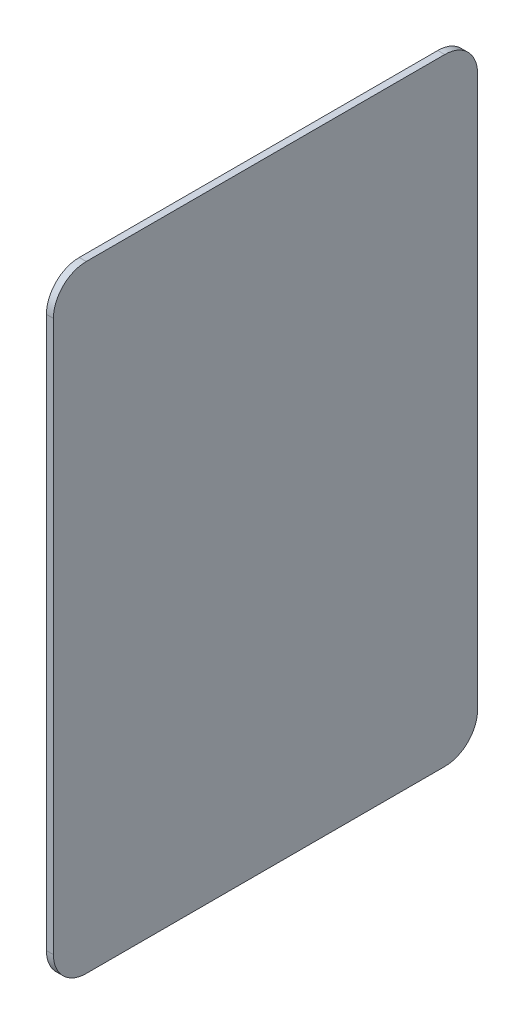
ISO-10303-21;
HEADER;
FILE_DESCRIPTION(('STEP AP214'),'2;1');
FILE_NAME('part.step','',(''),(''),'','','');
FILE_SCHEMA(('AUTOMOTIVE_DESIGN { 1 0 10303 214 1 1 1 1 }'));
ENDSEC;
DATA;
#1=APPLICATION_CONTEXT('core data for automotive mechanical design processes');
#2=APPLICATION_PROTOCOL_DEFINITION('international standard','automotive_design',2000,#1);
#3=PRODUCT_CONTEXT('',#1,'mechanical');
#4=PRODUCT('Part','Part','',(#3));
#5=PRODUCT_RELATED_PRODUCT_CATEGORY('part','',(#4));
#6=PRODUCT_DEFINITION_FORMATION('','',#4);
#7=PRODUCT_DEFINITION_CONTEXT('part definition',#1,'design');
#8=PRODUCT_DEFINITION('design','',#6,#7);
#9=PRODUCT_DEFINITION_SHAPE('','',#8);
#10=(LENGTH_UNIT() NAMED_UNIT(*) SI_UNIT(.MILLI.,.METRE.));
#11=(NAMED_UNIT(*) PLANE_ANGLE_UNIT() SI_UNIT($,.RADIAN.));
#12=(NAMED_UNIT(*) SI_UNIT($,.STERADIAN.) SOLID_ANGLE_UNIT());
#13=UNCERTAINTY_MEASURE_WITH_UNIT(LENGTH_MEASURE(1.E-05),#10,'distance_accuracy_value','');
#14=(GEOMETRIC_REPRESENTATION_CONTEXT(3) GLOBAL_UNCERTAINTY_ASSIGNED_CONTEXT((#13)) GLOBAL_UNIT_ASSIGNED_CONTEXT((#10,
#11,#12)) REPRESENTATION_CONTEXT('',''));
#15=CARTESIAN_POINT('',(0.,0.,0.));
#16=DIRECTION('',(0.,0.,1.));
#17=DIRECTION('',(1.,0.,0.));
#18=AXIS2_PLACEMENT_3D('',#15,#16,#17);
#19=CARTESIAN_POINT('',(-1.5875,94.531421496297,89.401946945784));
#20=DIRECTION('',(1.,0.,0.));
#21=DIRECTION('',(0.,0.,-1.));
#22=AXIS2_PLACEMENT_3D('',#19,#20,#21);
#23=CYLINDRICAL_SURFACE('',#22,7.453);
#24=CARTESIAN_POINT('',(0.,94.531421496297,89.401946945784));
#25=DIRECTION('',(1.,0.,0.));
#26=DIRECTION('',(0.,0.,-1.));
#27=AXIS2_PLACEMENT_3D('',#24,#25,#26);
#28=CIRCLE('',#27,7.453);
#29=CARTESIAN_POINT('',(0.,87.078421496297,89.4019469457841));
#30=VERTEX_POINT('',#29);
#31=CARTESIAN_POINT('',(0.,94.531421496297,81.948946945784));
#32=VERTEX_POINT('',#31);
#33=EDGE_CURVE('E135',#30,#32,#28,.T.);
#34=ORIENTED_EDGE('',*,*,#33,.F.);
#35=DIRECTION('',(1.,0.,0.));
#36=VECTOR('',#35,1.);
#37=CARTESIAN_POINT('',(-1.5875,87.078421496297,89.4019469457841));
#38=LINE('',#37,#36);
#39=CARTESIAN_POINT('',(-1.5875,87.078421496297,89.4019469457841));
#40=VERTEX_POINT('',#39);
#41=EDGE_CURVE('E12',#40,#30,#38,.T.);
#42=ORIENTED_EDGE('',*,*,#41,.F.);
#43=CARTESIAN_POINT('',(-1.5875,94.531421496297,89.401946945784));
#44=DIRECTION('',(1.,0.,0.));
#45=DIRECTION('',(0.,0.,-1.));
#46=AXIS2_PLACEMENT_3D('',#43,#44,#45);
#47=CIRCLE('',#46,7.453);
#48=CARTESIAN_POINT('',(-1.5875,94.531421496297,81.948946945784));
#49=VERTEX_POINT('',#48);
#50=EDGE_CURVE('E173',#40,#49,#47,.T.);
#51=ORIENTED_EDGE('',*,*,#50,.T.);
#52=DIRECTION('',(1.,0.,0.));
#53=VECTOR('',#52,1.);
#54=CARTESIAN_POINT('',(-1.5875,94.531421496297,81.948946945784));
#55=LINE('',#54,#53);
#56=EDGE_CURVE('E41',#49,#32,#55,.T.);
#57=ORIENTED_EDGE('',*,*,#56,.T.);
#58=EDGE_LOOP('',(#34,#42,#51,#57));
#59=FACE_BOUND('',#58,.T.);
#60=ADVANCED_FACE('F38',(#59),#23,.T.);
#61=CARTESIAN_POINT('',(-1.5875,87.078421496297,170.808946945784));
#62=DIRECTION('',(0.,-1.,0.));
#63=DIRECTION('',(0.,0.,-1.));
#64=AXIS2_PLACEMENT_3D('',#61,#62,#63);
#65=PLANE('',#64);
#66=DIRECTION('',(0.,0.,-1.));
#67=VECTOR('',#66,1.);
#68=CARTESIAN_POINT('',(0.,87.078421496297,170.808946945784));
#69=LINE('',#68,#67);
#70=CARTESIAN_POINT('',(0.,87.078421496297,170.808946945784));
#71=VERTEX_POINT('',#70);
#72=EDGE_CURVE('E169',#71,#30,#69,.T.);
#73=ORIENTED_EDGE('',*,*,#72,.F.);
#74=DIRECTION('',(1.,0.,0.));
#75=VECTOR('',#74,1.);
#76=CARTESIAN_POINT('',(-1.5875,87.078421496297,170.808946945784));
#77=LINE('',#76,#75);
#78=CARTESIAN_POINT('',(-1.5875,87.078421496297,170.808946945784));
#79=VERTEX_POINT('',#78);
#80=EDGE_CURVE('E47',#79,#71,#77,.T.);
#81=ORIENTED_EDGE('',*,*,#80,.F.);
#82=DIRECTION('',(0.,0.,-1.));
#83=VECTOR('',#82,1.);
#84=CARTESIAN_POINT('',(-1.5875,87.078421496297,170.808946945784));
#85=LINE('',#84,#83);
#86=EDGE_CURVE('E125',#79,#40,#85,.T.);
#87=ORIENTED_EDGE('',*,*,#86,.T.);
#88=ORIENTED_EDGE('',*,*,#41,.T.);
#89=EDGE_LOOP('',(#73,#81,#87,#88));
#90=FACE_BOUND('',#89,.T.);
#91=ADVANCED_FACE('F187',(#90),#65,.T.);
#92=CARTESIAN_POINT('',(-1.5875,94.531421496297,170.808946945784));
#93=DIRECTION('',(1.,0.,0.));
#94=DIRECTION('',(0.,0.,-1.));
#95=AXIS2_PLACEMENT_3D('',#92,#93,#94);
#96=CYLINDRICAL_SURFACE('',#95,7.45300000000001);
#97=CARTESIAN_POINT('',(0.,94.531421496297,170.808946945784));
#98=DIRECTION('',(1.,0.,0.));
#99=DIRECTION('',(0.,0.,-1.));
#100=AXIS2_PLACEMENT_3D('',#97,#98,#99);
#101=CIRCLE('',#100,7.45300000000001);
#102=CARTESIAN_POINT('',(0.,94.5314214962971,178.261946945784));
#103=VERTEX_POINT('',#102);
#104=EDGE_CURVE('E112',#103,#71,#101,.T.);
#105=ORIENTED_EDGE('',*,*,#104,.F.);
#106=DIRECTION('',(1.,0.,0.));
#107=VECTOR('',#106,1.);
#108=CARTESIAN_POINT('',(-1.5875,94.5314214962971,178.261946945784));
#109=LINE('',#108,#107);
#110=CARTESIAN_POINT('',(-1.5875,94.5314214962971,178.261946945784));
#111=VERTEX_POINT('',#110);
#112=EDGE_CURVE('E107',#111,#103,#109,.T.);
#113=ORIENTED_EDGE('',*,*,#112,.F.);
#114=CARTESIAN_POINT('',(-1.5875,94.531421496297,170.808946945784));
#115=DIRECTION('',(1.,0.,0.));
#116=DIRECTION('',(0.,0.,-1.));
#117=AXIS2_PLACEMENT_3D('',#114,#115,#116);
#118=CIRCLE('',#117,7.45300000000001);
#119=EDGE_CURVE('E110',#111,#79,#118,.T.);
#120=ORIENTED_EDGE('',*,*,#119,.T.);
#121=ORIENTED_EDGE('',*,*,#80,.T.);
#122=EDGE_LOOP('',(#105,#113,#120,#121));
#123=FACE_BOUND('',#122,.T.);
#124=ADVANCED_FACE('F109',(#123),#96,.T.);
#125=CARTESIAN_POINT('',(-1.5875,219.626421496297,178.261946945784));
#126=DIRECTION('',(0.,0.,1.));
#127=DIRECTION('',(1.,0.,0.));
#128=AXIS2_PLACEMENT_3D('',#125,#126,#127);
#129=PLANE('',#128);
#130=DIRECTION('',(0.,-1.,0.));
#131=VECTOR('',#130,1.);
#132=CARTESIAN_POINT('',(0.,219.626421496297,178.261946945784));
#133=LINE('',#132,#131);
#134=CARTESIAN_POINT('',(0.,219.626421496297,178.261946945784));
#135=VERTEX_POINT('',#134);
#136=EDGE_CURVE('E163',#135,#103,#133,.T.);
#137=ORIENTED_EDGE('',*,*,#136,.F.);
#138=DIRECTION('',(1.,0.,0.));
#139=VECTOR('',#138,1.);
#140=CARTESIAN_POINT('',(-1.5875,219.626421496297,178.261946945784));
#141=LINE('',#140,#139);
#142=CARTESIAN_POINT('',(-1.5875,219.626421496297,178.261946945784));
#143=VERTEX_POINT('',#142);
#144=EDGE_CURVE('E117',#143,#135,#141,.T.);
#145=ORIENTED_EDGE('',*,*,#144,.F.);
#146=DIRECTION('',(0.,-1.,0.));
#147=VECTOR('',#146,1.);
#148=CARTESIAN_POINT('',(-1.5875,219.626421496297,178.261946945784));
#149=LINE('',#148,#147);
#150=EDGE_CURVE('E123',#143,#111,#149,.T.);
#151=ORIENTED_EDGE('',*,*,#150,.T.);
#152=ORIENTED_EDGE('',*,*,#112,.T.);
#153=EDGE_LOOP('',(#137,#145,#151,#152));
#154=FACE_BOUND('',#153,.T.);
#155=ADVANCED_FACE('F127',(#154),#129,.T.);
#156=CARTESIAN_POINT('',(-1.5875,219.626421496297,170.808946945784));
#157=DIRECTION('',(1.,0.,0.));
#158=DIRECTION('',(0.,0.,-1.));
#159=AXIS2_PLACEMENT_3D('',#156,#157,#158);
#160=CYLINDRICAL_SURFACE('',#159,7.45300000000002);
#161=CARTESIAN_POINT('',(0.,219.626421496297,170.808946945784));
#162=DIRECTION('',(1.,0.,0.));
#163=DIRECTION('',(0.,0.,-1.));
#164=AXIS2_PLACEMENT_3D('',#161,#162,#163);
#165=CIRCLE('',#164,7.45300000000002);
#166=CARTESIAN_POINT('',(0.,227.079421496297,170.808946945784));
#167=VERTEX_POINT('',#166);
#168=EDGE_CURVE('E158',#167,#135,#165,.T.);
#169=ORIENTED_EDGE('',*,*,#168,.F.);
#170=DIRECTION('',(1.,0.,0.));
#171=VECTOR('',#170,1.);
#172=CARTESIAN_POINT('',(-1.5875,227.079421496297,170.808946945784));
#173=LINE('',#172,#171);
#174=CARTESIAN_POINT('',(-1.5875,227.079421496297,170.808946945784));
#175=VERTEX_POINT('',#174);
#176=EDGE_CURVE('E177',#175,#167,#173,.T.);
#177=ORIENTED_EDGE('',*,*,#176,.F.);
#178=CARTESIAN_POINT('',(-1.5875,219.626421496297,170.808946945784));
#179=DIRECTION('',(1.,0.,0.));
#180=DIRECTION('',(0.,0.,-1.));
#181=AXIS2_PLACEMENT_3D('',#178,#179,#180);
#182=CIRCLE('',#181,7.45300000000002);
#183=EDGE_CURVE('E128',#175,#143,#182,.T.);
#184=ORIENTED_EDGE('',*,*,#183,.T.);
#185=ORIENTED_EDGE('',*,*,#144,.T.);
#186=EDGE_LOOP('',(#169,#177,#184,#185));
#187=FACE_BOUND('',#186,.T.);
#188=ADVANCED_FACE('F200',(#187),#160,.T.);
#189=CARTESIAN_POINT('',(-1.5875,227.079421496297,89.4019469457841));
#190=DIRECTION('',(0.,1.,0.));
#191=DIRECTION('',(0.,0.,1.));
#192=AXIS2_PLACEMENT_3D('',#189,#190,#191);
#193=PLANE('',#192);
#194=DIRECTION('',(0.,0.,1.));
#195=VECTOR('',#194,1.);
#196=CARTESIAN_POINT('',(0.,227.079421496297,89.4019469457841));
#197=LINE('',#196,#195);
#198=CARTESIAN_POINT('',(0.,227.079421496297,89.4019469457841));
#199=VERTEX_POINT('',#198);
#200=EDGE_CURVE('E153',#199,#167,#197,.T.);
#201=ORIENTED_EDGE('',*,*,#200,.F.);
#202=DIRECTION('',(1.,0.,0.));
#203=VECTOR('',#202,1.);
#204=CARTESIAN_POINT('',(-1.5875,227.079421496297,89.4019469457841));
#205=LINE('',#204,#203);
#206=CARTESIAN_POINT('',(-1.5875,227.079421496297,89.4019469457841));
#207=VERTEX_POINT('',#206);
#208=EDGE_CURVE('E179',#207,#199,#205,.T.);
#209=ORIENTED_EDGE('',*,*,#208,.F.);
#210=DIRECTION('',(0.,0.,1.));
#211=VECTOR('',#210,1.);
#212=CARTESIAN_POINT('',(-1.5875,227.079421496297,89.4019469457841));
#213=LINE('',#212,#211);
#214=EDGE_CURVE('E130',#207,#175,#213,.T.);
#215=ORIENTED_EDGE('',*,*,#214,.T.);
#216=ORIENTED_EDGE('',*,*,#176,.T.);
#217=EDGE_LOOP('',(#201,#209,#215,#216));
#218=FACE_BOUND('',#217,.T.);
#219=ADVANCED_FACE('F203',(#218),#193,.T.);
#220=CARTESIAN_POINT('',(-1.5875,219.626421496297,89.401946945784));
#221=DIRECTION('',(1.,0.,0.));
#222=DIRECTION('',(0.,0.,-1.));
#223=AXIS2_PLACEMENT_3D('',#220,#221,#222);
#224=CYLINDRICAL_SURFACE('',#223,7.45300000000001);
#225=CARTESIAN_POINT('',(0.,219.626421496297,89.401946945784));
#226=DIRECTION('',(1.,0.,0.));
#227=DIRECTION('',(0.,0.,-1.));
#228=AXIS2_PLACEMENT_3D('',#225,#226,#227);
#229=CIRCLE('',#228,7.45300000000001);
#230=CARTESIAN_POINT('',(0.,219.626421496297,81.948946945784));
#231=VERTEX_POINT('',#230);
#232=EDGE_CURVE('E149',#231,#199,#229,.T.);
#233=ORIENTED_EDGE('',*,*,#232,.F.);
#234=DIRECTION('',(1.,0.,0.));
#235=VECTOR('',#234,1.);
#236=CARTESIAN_POINT('',(-1.5875,219.626421496297,81.948946945784));
#237=LINE('',#236,#235);
#238=CARTESIAN_POINT('',(-1.5875,219.626421496297,81.948946945784));
#239=VERTEX_POINT('',#238);
#240=EDGE_CURVE('E180',#239,#231,#237,.T.);
#241=ORIENTED_EDGE('',*,*,#240,.F.);
#242=CARTESIAN_POINT('',(-1.5875,219.626421496297,89.401946945784));
#243=DIRECTION('',(1.,0.,0.));
#244=DIRECTION('',(0.,0.,-1.));
#245=AXIS2_PLACEMENT_3D('',#242,#243,#244);
#246=CIRCLE('',#245,7.45300000000001);
#247=EDGE_CURVE('E279',#239,#207,#246,.T.);
#248=ORIENTED_EDGE('',*,*,#247,.T.);
#249=ORIENTED_EDGE('',*,*,#208,.T.);
#250=EDGE_LOOP('',(#233,#241,#248,#249));
#251=FACE_BOUND('',#250,.T.);
#252=ADVANCED_FACE('F207',(#251),#224,.T.);
#253=CARTESIAN_POINT('',(-1.5875,94.531421496297,81.948946945784));
#254=DIRECTION('',(0.,0.,-1.));
#255=DIRECTION('',(-1.,0.,0.));
#256=AXIS2_PLACEMENT_3D('',#253,#254,#255);
#257=PLANE('',#256);
#258=DIRECTION('',(0.,1.,0.));
#259=VECTOR('',#258,1.);
#260=CARTESIAN_POINT('',(0.,94.531421496297,81.948946945784));
#261=LINE('',#260,#259);
#262=EDGE_CURVE('E140',#32,#231,#261,.T.);
#263=ORIENTED_EDGE('',*,*,#262,.F.);
#264=ORIENTED_EDGE('',*,*,#56,.F.);
#265=DIRECTION('',(0.,1.,0.));
#266=VECTOR('',#265,1.);
#267=CARTESIAN_POINT('',(-1.5875,94.531421496297,81.948946945784));
#268=LINE('',#267,#266);
#269=EDGE_CURVE('E280',#49,#239,#268,.T.);
#270=ORIENTED_EDGE('',*,*,#269,.T.);
#271=ORIENTED_EDGE('',*,*,#240,.T.);
#272=EDGE_LOOP('',(#263,#264,#270,#271));
#273=FACE_BOUND('',#272,.T.);
#274=ADVANCED_FACE('F183',(#273),#257,.T.);
#275=CARTESIAN_POINT('',(-1.5875,94.531421496297,89.401946945784));
#276=DIRECTION('',(1.,0.,0.));
#277=DIRECTION('',(0.,0.,-1.));
#278=AXIS2_PLACEMENT_3D('',#275,#276,#277);
#279=PLANE('',#278);
#280=ORIENTED_EDGE('',*,*,#50,.F.);
#281=ORIENTED_EDGE('',*,*,#86,.F.);
#282=ORIENTED_EDGE('',*,*,#119,.F.);
#283=ORIENTED_EDGE('',*,*,#150,.F.);
#284=ORIENTED_EDGE('',*,*,#183,.F.);
#285=ORIENTED_EDGE('',*,*,#214,.F.);
#286=ORIENTED_EDGE('',*,*,#247,.F.);
#287=ORIENTED_EDGE('',*,*,#269,.F.);
#288=EDGE_LOOP('',(#280,#281,#282,#283,#284,#285,#286,#287));
#289=FACE_BOUND('',#288,.T.);
#290=ADVANCED_FACE('F121',(#289),#279,.F.);
#291=CARTESIAN_POINT('',(0.,94.531421496297,89.401946945784));
#292=DIRECTION('',(1.,0.,0.));
#293=DIRECTION('',(0.,0.,-1.));
#294=AXIS2_PLACEMENT_3D('',#291,#292,#293);
#295=PLANE('',#294);
#296=ORIENTED_EDGE('',*,*,#33,.T.);
#297=ORIENTED_EDGE('',*,*,#262,.T.);
#298=ORIENTED_EDGE('',*,*,#232,.T.);
#299=ORIENTED_EDGE('',*,*,#200,.T.);
#300=ORIENTED_EDGE('',*,*,#168,.T.);
#301=ORIENTED_EDGE('',*,*,#136,.T.);
#302=ORIENTED_EDGE('',*,*,#104,.T.);
#303=ORIENTED_EDGE('',*,*,#72,.T.);
#304=EDGE_LOOP('',(#296,#297,#298,#299,#300,#301,#302,#303));
#305=FACE_BOUND('',#304,.T.);
#306=ADVANCED_FACE('F186',(#305),#295,.T.);
#307=CLOSED_SHELL('',(#60,#91,#124,#155,#188,#219,#252,#274,#290,#306));
#308=MANIFOLD_SOLID_BREP('B2',#307);
#309=ADVANCED_BREP_SHAPE_REPRESENTATION('',(#18,#308),#14);
#310=SHAPE_DEFINITION_REPRESENTATION(#9,#309);
ENDSEC;
END-ISO-10303-21;
